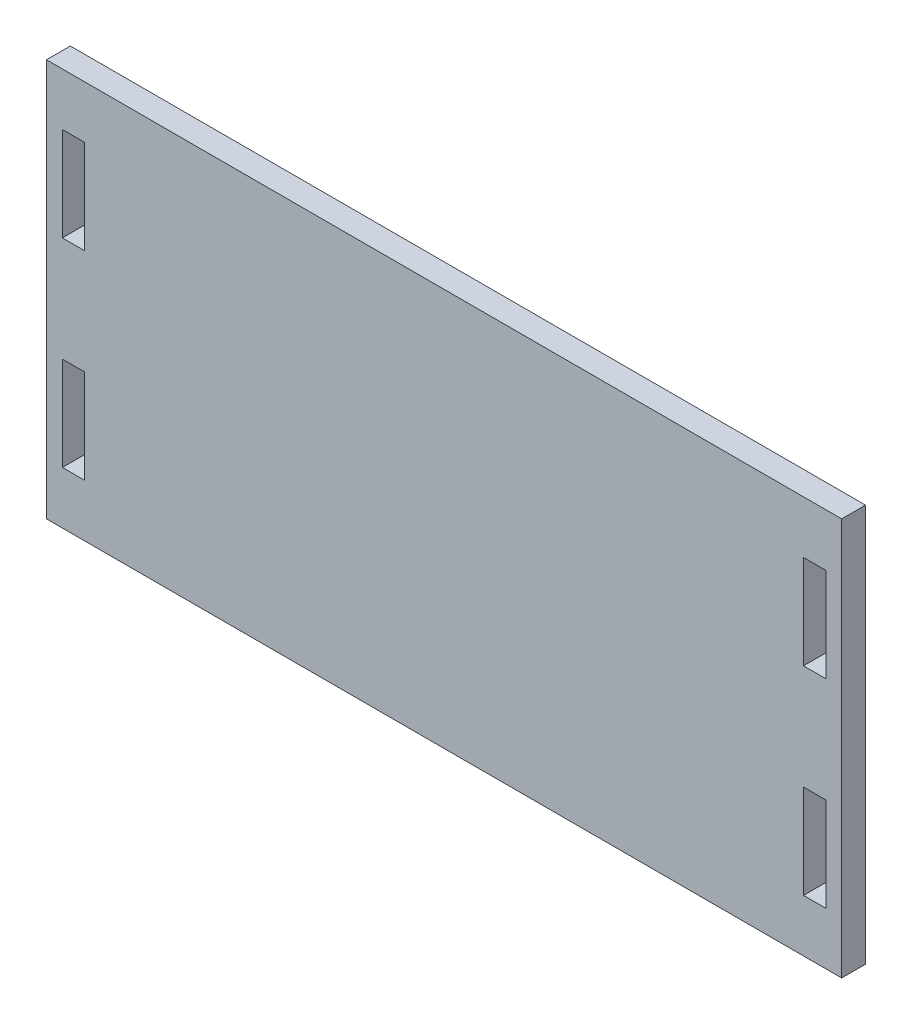
ISO-10303-21;
HEADER;
FILE_DESCRIPTION(('STEP AP214'),'2;1');
FILE_NAME('part.step','',(''),(''),'','','');
FILE_SCHEMA(('AUTOMOTIVE_DESIGN { 1 0 10303 214 1 1 1 1 }'));
ENDSEC;
DATA;
#1=APPLICATION_CONTEXT('core data for automotive mechanical design processes');
#2=APPLICATION_PROTOCOL_DEFINITION('international standard','automotive_design',2000,#1);
#3=PRODUCT_CONTEXT('',#1,'mechanical');
#4=PRODUCT('Part','Part','',(#3));
#5=PRODUCT_RELATED_PRODUCT_CATEGORY('part','',(#4));
#6=PRODUCT_DEFINITION_FORMATION('','',#4);
#7=PRODUCT_DEFINITION_CONTEXT('part definition',#1,'design');
#8=PRODUCT_DEFINITION('design','',#6,#7);
#9=PRODUCT_DEFINITION_SHAPE('','',#8);
#10=(LENGTH_UNIT() NAMED_UNIT(*) SI_UNIT(.MILLI.,.METRE.));
#11=(NAMED_UNIT(*) PLANE_ANGLE_UNIT() SI_UNIT($,.RADIAN.));
#12=(NAMED_UNIT(*) SI_UNIT($,.STERADIAN.) SOLID_ANGLE_UNIT());
#13=UNCERTAINTY_MEASURE_WITH_UNIT(LENGTH_MEASURE(1.E-05),#10,'distance_accuracy_value','');
#14=(GEOMETRIC_REPRESENTATION_CONTEXT(3) GLOBAL_UNCERTAINTY_ASSIGNED_CONTEXT((#13)) GLOBAL_UNIT_ASSIGNED_CONTEXT((#10,
#11,#12)) REPRESENTATION_CONTEXT('',''));
#15=CARTESIAN_POINT('',(0.,0.,0.));
#16=DIRECTION('',(0.,0.,1.));
#17=DIRECTION('',(1.,0.,0.));
#18=AXIS2_PLACEMENT_3D('',#15,#16,#17);
#19=CARTESIAN_POINT('',(0.,0.,-3.));
#20=DIRECTION('',(-1.,0.,0.));
#21=DIRECTION('',(0.,0.,1.));
#22=AXIS2_PLACEMENT_3D('',#19,#20,#21);
#23=PLANE('',#22);
#24=DIRECTION('',(0.,-1.,0.));
#25=VECTOR('',#24,1.);
#26=CARTESIAN_POINT('',(0.,0.,0.));
#27=LINE('',#26,#25);
#28=CARTESIAN_POINT('',(0.,50.,0.));
#29=VERTEX_POINT('',#28);
#30=CARTESIAN_POINT('',(0.,0.,0.));
#31=VERTEX_POINT('',#30);
#32=EDGE_CURVE('E298',#29,#31,#27,.T.);
#33=ORIENTED_EDGE('',*,*,#32,.F.);
#34=DIRECTION('',(0.,0.,1.));
#35=VECTOR('',#34,1.);
#36=CARTESIAN_POINT('',(0.,50.,-3.));
#37=LINE('',#36,#35);
#38=CARTESIAN_POINT('',(0.,50.,-3.));
#39=VERTEX_POINT('',#38);
#40=EDGE_CURVE('E11',#39,#29,#37,.T.);
#41=ORIENTED_EDGE('',*,*,#40,.F.);
#42=DIRECTION('',(0.,-1.,0.));
#43=VECTOR('',#42,1.);
#44=CARTESIAN_POINT('',(0.,0.,-3.));
#45=LINE('',#44,#43);
#46=CARTESIAN_POINT('',(0.,0.,-3.));
#47=VERTEX_POINT('',#46);
#48=EDGE_CURVE('E305',#39,#47,#45,.T.);
#49=ORIENTED_EDGE('',*,*,#48,.T.);
#50=DIRECTION('',(0.,0.,1.));
#51=VECTOR('',#50,1.);
#52=CARTESIAN_POINT('',(0.,0.,-3.));
#53=LINE('',#52,#51);
#54=EDGE_CURVE('E38',#47,#31,#53,.T.);
#55=ORIENTED_EDGE('',*,*,#54,.T.);
#56=EDGE_LOOP('',(#33,#41,#49,#55));
#57=FACE_BOUND('',#56,.T.);
#58=ADVANCED_FACE('F35',(#57),#23,.T.);
#59=CARTESIAN_POINT('',(0.,50.,-3.));
#60=DIRECTION('',(0.,1.,0.));
#61=DIRECTION('',(0.,0.,1.));
#62=AXIS2_PLACEMENT_3D('',#59,#60,#61);
#63=PLANE('',#62);
#64=DIRECTION('',(-1.,0.,0.));
#65=VECTOR('',#64,1.);
#66=CARTESIAN_POINT('',(0.,50.,0.));
#67=LINE('',#66,#65);
#68=CARTESIAN_POINT('',(100.,50.,0.));
#69=VERTEX_POINT('',#68);
#70=EDGE_CURVE('E309',#69,#29,#67,.T.);
#71=ORIENTED_EDGE('',*,*,#70,.F.);
#72=DIRECTION('',(0.,0.,1.));
#73=VECTOR('',#72,1.);
#74=CARTESIAN_POINT('',(100.,50.,-3.));
#75=LINE('',#74,#73);
#76=CARTESIAN_POINT('',(100.,50.,-3.));
#77=VERTEX_POINT('',#76);
#78=EDGE_CURVE('E43',#77,#69,#75,.T.);
#79=ORIENTED_EDGE('',*,*,#78,.F.);
#80=DIRECTION('',(-1.,0.,0.));
#81=VECTOR('',#80,1.);
#82=CARTESIAN_POINT('',(0.,50.,-3.));
#83=LINE('',#82,#81);
#84=EDGE_CURVE('E315',#77,#39,#83,.T.);
#85=ORIENTED_EDGE('',*,*,#84,.T.);
#86=ORIENTED_EDGE('',*,*,#40,.T.);
#87=EDGE_LOOP('',(#71,#79,#85,#86));
#88=FACE_BOUND('',#87,.T.);
#89=ADVANCED_FACE('F341',(#88),#63,.T.);
#90=CARTESIAN_POINT('',(100.,0.,-3.));
#91=DIRECTION('',(1.,0.,0.));
#92=DIRECTION('',(0.,0.,-1.));
#93=AXIS2_PLACEMENT_3D('',#90,#91,#92);
#94=PLANE('',#93);
#95=DIRECTION('',(0.,1.,0.));
#96=VECTOR('',#95,1.);
#97=CARTESIAN_POINT('',(100.,0.,0.));
#98=LINE('',#97,#96);
#99=CARTESIAN_POINT('',(100.,0.,0.));
#100=VERTEX_POINT('',#99);
#101=EDGE_CURVE('E323',#100,#69,#98,.T.);
#102=ORIENTED_EDGE('',*,*,#101,.F.);
#103=DIRECTION('',(0.,0.,1.));
#104=VECTOR('',#103,1.);
#105=CARTESIAN_POINT('',(100.,0.,-3.));
#106=LINE('',#105,#104);
#107=CARTESIAN_POINT('',(100.,0.,-3.));
#108=VERTEX_POINT('',#107);
#109=EDGE_CURVE('E328',#108,#100,#106,.T.);
#110=ORIENTED_EDGE('',*,*,#109,.F.);
#111=DIRECTION('',(0.,1.,0.));
#112=VECTOR('',#111,1.);
#113=CARTESIAN_POINT('',(100.,0.,-3.));
#114=LINE('',#113,#112);
#115=EDGE_CURVE('E312',#108,#77,#114,.T.);
#116=ORIENTED_EDGE('',*,*,#115,.T.);
#117=ORIENTED_EDGE('',*,*,#78,.T.);
#118=EDGE_LOOP('',(#102,#110,#116,#117));
#119=FACE_BOUND('',#118,.T.);
#120=ADVANCED_FACE('F346',(#119),#94,.T.);
#121=CARTESIAN_POINT('',(0.,0.,-3.));
#122=DIRECTION('',(0.,-1.,0.));
#123=DIRECTION('',(0.,0.,-1.));
#124=AXIS2_PLACEMENT_3D('',#121,#122,#123);
#125=PLANE('',#124);
#126=DIRECTION('',(1.,0.,0.));
#127=VECTOR('',#126,1.);
#128=CARTESIAN_POINT('',(0.,0.,0.));
#129=LINE('',#128,#127);
#130=EDGE_CURVE('E320',#31,#100,#129,.T.);
#131=ORIENTED_EDGE('',*,*,#130,.F.);
#132=ORIENTED_EDGE('',*,*,#54,.F.);
#133=DIRECTION('',(1.,0.,0.));
#134=VECTOR('',#133,1.);
#135=CARTESIAN_POINT('',(0.,0.,-3.));
#136=LINE('',#135,#134);
#137=EDGE_CURVE('E308',#47,#108,#136,.T.);
#138=ORIENTED_EDGE('',*,*,#137,.T.);
#139=ORIENTED_EDGE('',*,*,#109,.T.);
#140=EDGE_LOOP('',(#131,#132,#138,#139));
#141=FACE_BOUND('',#140,.T.);
#142=ADVANCED_FACE('F336',(#141),#125,.T.);
#143=CARTESIAN_POINT('',(0.,0.,-3.));
#144=DIRECTION('',(0.,0.,-1.));
#145=DIRECTION('',(-1.,0.,0.));
#146=AXIS2_PLACEMENT_3D('',#143,#144,#145);
#147=PLANE('',#146);
#148=DIRECTION('',(0.,1.,0.));
#149=VECTOR('',#148,1.);
#150=CARTESIAN_POINT('',(98.,43.4,-3.));
#151=LINE('',#150,#149);
#152=CARTESIAN_POINT('',(98.,31.6,-3.));
#153=VERTEX_POINT('',#152);
#154=CARTESIAN_POINT('',(98.,43.4,-3.));
#155=VERTEX_POINT('',#154);
#156=EDGE_CURVE('E174',#153,#155,#151,.T.);
#157=ORIENTED_EDGE('',*,*,#156,.T.);
#158=DIRECTION('',(-1.,0.,0.));
#159=VECTOR('',#158,1.);
#160=CARTESIAN_POINT('',(98.,43.4,-3.));
#161=LINE('',#160,#159);
#162=CARTESIAN_POINT('',(95.2,43.4,-3.));
#163=VERTEX_POINT('',#162);
#164=EDGE_CURVE('E183',#155,#163,#161,.T.);
#165=ORIENTED_EDGE('',*,*,#164,.T.);
#166=DIRECTION('',(0.,-1.,0.));
#167=VECTOR('',#166,1.);
#168=CARTESIAN_POINT('',(95.2,43.4,-3.));
#169=LINE('',#168,#167);
#170=CARTESIAN_POINT('',(95.2,31.6,-3.));
#171=VERTEX_POINT('',#170);
#172=EDGE_CURVE('E51',#163,#171,#169,.T.);
#173=ORIENTED_EDGE('',*,*,#172,.T.);
#174=DIRECTION('',(1.,0.,0.));
#175=VECTOR('',#174,1.);
#176=CARTESIAN_POINT('',(98.,31.6,-3.));
#177=LINE('',#176,#175);
#178=EDGE_CURVE('E180',#171,#153,#177,.T.);
#179=ORIENTED_EDGE('',*,*,#178,.T.);
#180=EDGE_LOOP('',(#157,#165,#173,#179));
#181=FACE_BOUND('',#180,.T.);
#182=DIRECTION('',(1.,0.,0.));
#183=VECTOR('',#182,1.);
#184=CARTESIAN_POINT('',(98.,6.59999999999999,-3.));
#185=LINE('',#184,#183);
#186=CARTESIAN_POINT('',(95.2,6.59999999999999,-3.));
#187=VERTEX_POINT('',#186);
#188=CARTESIAN_POINT('',(98.,6.59999999999999,-3.));
#189=VERTEX_POINT('',#188);
#190=EDGE_CURVE('E209',#187,#189,#185,.T.);
#191=ORIENTED_EDGE('',*,*,#190,.T.);
#192=DIRECTION('',(0.,1.,0.));
#193=VECTOR('',#192,1.);
#194=CARTESIAN_POINT('',(98.,6.59999999999999,-3.));
#195=LINE('',#194,#193);
#196=CARTESIAN_POINT('',(98.,18.4,-3.));
#197=VERTEX_POINT('',#196);
#198=EDGE_CURVE('E212',#189,#197,#195,.T.);
#199=ORIENTED_EDGE('',*,*,#198,.T.);
#200=DIRECTION('',(-1.,0.,0.));
#201=VECTOR('',#200,1.);
#202=CARTESIAN_POINT('',(98.,18.4,-3.));
#203=LINE('',#202,#201);
#204=CARTESIAN_POINT('',(95.2,18.4,-3.));
#205=VERTEX_POINT('',#204);
#206=EDGE_CURVE('E216',#197,#205,#203,.T.);
#207=ORIENTED_EDGE('',*,*,#206,.T.);
#208=DIRECTION('',(0.,-1.,0.));
#209=VECTOR('',#208,1.);
#210=CARTESIAN_POINT('',(95.2,6.59999999999999,-3.));
#211=LINE('',#210,#209);
#212=EDGE_CURVE('E219',#205,#187,#211,.T.);
#213=ORIENTED_EDGE('',*,*,#212,.T.);
#214=EDGE_LOOP('',(#191,#199,#207,#213));
#215=FACE_BOUND('',#214,.T.);
#216=DIRECTION('',(0.,-1.,0.));
#217=VECTOR('',#216,1.);
#218=CARTESIAN_POINT('',(2.,6.59999999999999,-3.));
#219=LINE('',#218,#217);
#220=CARTESIAN_POINT('',(2.,18.4,-3.));
#221=VERTEX_POINT('',#220);
#222=CARTESIAN_POINT('',(2.,6.59999999999999,-3.));
#223=VERTEX_POINT('',#222);
#224=EDGE_CURVE('E241',#221,#223,#219,.T.);
#225=ORIENTED_EDGE('',*,*,#224,.T.);
#226=DIRECTION('',(1.,0.,0.));
#227=VECTOR('',#226,1.);
#228=CARTESIAN_POINT('',(2.,6.59999999999999,-3.));
#229=LINE('',#228,#227);
#230=CARTESIAN_POINT('',(4.8,6.59999999999999,-3.));
#231=VERTEX_POINT('',#230);
#232=EDGE_CURVE('E244',#223,#231,#229,.T.);
#233=ORIENTED_EDGE('',*,*,#232,.T.);
#234=DIRECTION('',(0.,1.,0.));
#235=VECTOR('',#234,1.);
#236=CARTESIAN_POINT('',(4.8,6.59999999999999,-3.));
#237=LINE('',#236,#235);
#238=CARTESIAN_POINT('',(4.8,18.4,-3.));
#239=VERTEX_POINT('',#238);
#240=EDGE_CURVE('E248',#231,#239,#237,.T.);
#241=ORIENTED_EDGE('',*,*,#240,.T.);
#242=DIRECTION('',(-1.,0.,0.));
#243=VECTOR('',#242,1.);
#244=CARTESIAN_POINT('',(2.,18.4,-3.));
#245=LINE('',#244,#243);
#246=EDGE_CURVE('E251',#239,#221,#245,.T.);
#247=ORIENTED_EDGE('',*,*,#246,.T.);
#248=EDGE_LOOP('',(#225,#233,#241,#247));
#249=FACE_BOUND('',#248,.T.);
#250=DIRECTION('',(0.,-1.,0.));
#251=VECTOR('',#250,1.);
#252=CARTESIAN_POINT('',(2.,43.4,-3.));
#253=LINE('',#252,#251);
#254=CARTESIAN_POINT('',(2.,43.4,-3.));
#255=VERTEX_POINT('',#254);
#256=CARTESIAN_POINT('',(2.,31.6,-3.));
#257=VERTEX_POINT('',#256);
#258=EDGE_CURVE('E273',#255,#257,#253,.T.);
#259=ORIENTED_EDGE('',*,*,#258,.T.);
#260=DIRECTION('',(1.,0.,0.));
#261=VECTOR('',#260,1.);
#262=CARTESIAN_POINT('',(2.,31.6,-3.));
#263=LINE('',#262,#261);
#264=CARTESIAN_POINT('',(4.8,31.6,-3.));
#265=VERTEX_POINT('',#264);
#266=EDGE_CURVE('E276',#257,#265,#263,.T.);
#267=ORIENTED_EDGE('',*,*,#266,.T.);
#268=DIRECTION('',(0.,1.,0.));
#269=VECTOR('',#268,1.);
#270=CARTESIAN_POINT('',(4.8,43.4,-3.));
#271=LINE('',#270,#269);
#272=CARTESIAN_POINT('',(4.8,43.4,-3.));
#273=VERTEX_POINT('',#272);
#274=EDGE_CURVE('E280',#265,#273,#271,.T.);
#275=ORIENTED_EDGE('',*,*,#274,.T.);
#276=DIRECTION('',(-1.,0.,0.));
#277=VECTOR('',#276,1.);
#278=CARTESIAN_POINT('',(2.,43.4,-3.));
#279=LINE('',#278,#277);
#280=EDGE_CURVE('E283',#273,#255,#279,.T.);
#281=ORIENTED_EDGE('',*,*,#280,.T.);
#282=EDGE_LOOP('',(#259,#267,#275,#281));
#283=FACE_BOUND('',#282,.T.);
#284=ORIENTED_EDGE('',*,*,#48,.F.);
#285=ORIENTED_EDGE('',*,*,#84,.F.);
#286=ORIENTED_EDGE('',*,*,#115,.F.);
#287=ORIENTED_EDGE('',*,*,#137,.F.);
#288=EDGE_LOOP('',(#284,#285,#286,#287));
#289=FACE_BOUND('',#288,.T.);
#290=ADVANCED_FACE('F187',(#181,#215,#249,#283,#289),#147,.T.);
#291=CARTESIAN_POINT('',(0.,0.,0.));
#292=DIRECTION('',(0.,0.,-1.));
#293=DIRECTION('',(-1.,0.,0.));
#294=AXIS2_PLACEMENT_3D('',#291,#292,#293);
#295=PLANE('',#294);
#296=DIRECTION('',(-1.,0.,0.));
#297=VECTOR('',#296,1.);
#298=CARTESIAN_POINT('',(98.,43.4,0.));
#299=LINE('',#298,#297);
#300=CARTESIAN_POINT('',(98.,43.4,0.));
#301=VERTEX_POINT('',#300);
#302=CARTESIAN_POINT('',(95.2,43.4,0.));
#303=VERTEX_POINT('',#302);
#304=EDGE_CURVE('E199',#301,#303,#299,.T.);
#305=ORIENTED_EDGE('',*,*,#304,.F.);
#306=DIRECTION('',(0.,1.,0.));
#307=VECTOR('',#306,1.);
#308=CARTESIAN_POINT('',(98.,43.4,0.));
#309=LINE('',#308,#307);
#310=CARTESIAN_POINT('',(98.,31.6,0.));
#311=VERTEX_POINT('',#310);
#312=EDGE_CURVE('E59',#311,#301,#309,.T.);
#313=ORIENTED_EDGE('',*,*,#312,.F.);
#314=DIRECTION('',(1.,0.,0.));
#315=VECTOR('',#314,1.);
#316=CARTESIAN_POINT('',(98.,31.6,0.));
#317=LINE('',#316,#315);
#318=CARTESIAN_POINT('',(95.2,31.6,0.));
#319=VERTEX_POINT('',#318);
#320=EDGE_CURVE('E190',#319,#311,#317,.T.);
#321=ORIENTED_EDGE('',*,*,#320,.F.);
#322=DIRECTION('',(0.,-1.,0.));
#323=VECTOR('',#322,1.);
#324=CARTESIAN_POINT('',(95.2,43.4,0.));
#325=LINE('',#324,#323);
#326=EDGE_CURVE('E193',#303,#319,#325,.T.);
#327=ORIENTED_EDGE('',*,*,#326,.F.);
#328=EDGE_LOOP('',(#305,#313,#321,#327));
#329=FACE_BOUND('',#328,.T.);
#330=DIRECTION('',(0.,1.,0.));
#331=VECTOR('',#330,1.);
#332=CARTESIAN_POINT('',(98.,6.59999999999999,0.));
#333=LINE('',#332,#331);
#334=CARTESIAN_POINT('',(98.,6.59999999999999,0.));
#335=VERTEX_POINT('',#334);
#336=CARTESIAN_POINT('',(98.,18.4,0.));
#337=VERTEX_POINT('',#336);
#338=EDGE_CURVE('E224',#335,#337,#333,.T.);
#339=ORIENTED_EDGE('',*,*,#338,.F.);
#340=DIRECTION('',(1.,0.,0.));
#341=VECTOR('',#340,1.);
#342=CARTESIAN_POINT('',(98.,6.59999999999999,0.));
#343=LINE('',#342,#341);
#344=CARTESIAN_POINT('',(95.2,6.59999999999999,0.));
#345=VERTEX_POINT('',#344);
#346=EDGE_CURVE('E205',#345,#335,#343,.T.);
#347=ORIENTED_EDGE('',*,*,#346,.F.);
#348=DIRECTION('',(0.,-1.,0.));
#349=VECTOR('',#348,1.);
#350=CARTESIAN_POINT('',(95.2,6.59999999999999,0.));
#351=LINE('',#350,#349);
#352=CARTESIAN_POINT('',(95.2,18.4,0.));
#353=VERTEX_POINT('',#352);
#354=EDGE_CURVE('E213',#353,#345,#351,.T.);
#355=ORIENTED_EDGE('',*,*,#354,.F.);
#356=DIRECTION('',(-1.,0.,0.));
#357=VECTOR('',#356,1.);
#358=CARTESIAN_POINT('',(98.,18.4,0.));
#359=LINE('',#358,#357);
#360=EDGE_CURVE('E227',#337,#353,#359,.T.);
#361=ORIENTED_EDGE('',*,*,#360,.F.);
#362=EDGE_LOOP('',(#339,#347,#355,#361));
#363=FACE_BOUND('',#362,.T.);
#364=DIRECTION('',(1.,0.,0.));
#365=VECTOR('',#364,1.);
#366=CARTESIAN_POINT('',(2.,6.59999999999999,0.));
#367=LINE('',#366,#365);
#368=CARTESIAN_POINT('',(2.,6.59999999999999,0.));
#369=VERTEX_POINT('',#368);
#370=CARTESIAN_POINT('',(4.8,6.59999999999999,0.));
#371=VERTEX_POINT('',#370);
#372=EDGE_CURVE('E256',#369,#371,#367,.T.);
#373=ORIENTED_EDGE('',*,*,#372,.F.);
#374=DIRECTION('',(0.,-1.,0.));
#375=VECTOR('',#374,1.);
#376=CARTESIAN_POINT('',(2.,6.59999999999999,0.));
#377=LINE('',#376,#375);
#378=CARTESIAN_POINT('',(2.,18.4,0.));
#379=VERTEX_POINT('',#378);
#380=EDGE_CURVE('E234',#379,#369,#377,.T.);
#381=ORIENTED_EDGE('',*,*,#380,.F.);
#382=DIRECTION('',(-1.,0.,0.));
#383=VECTOR('',#382,1.);
#384=CARTESIAN_POINT('',(2.,18.4,0.));
#385=LINE('',#384,#383);
#386=CARTESIAN_POINT('',(4.8,18.4,0.));
#387=VERTEX_POINT('',#386);
#388=EDGE_CURVE('E245',#387,#379,#385,.T.);
#389=ORIENTED_EDGE('',*,*,#388,.F.);
#390=DIRECTION('',(0.,1.,0.));
#391=VECTOR('',#390,1.);
#392=CARTESIAN_POINT('',(4.8,6.59999999999999,0.));
#393=LINE('',#392,#391);
#394=EDGE_CURVE('E259',#371,#387,#393,.T.);
#395=ORIENTED_EDGE('',*,*,#394,.F.);
#396=EDGE_LOOP('',(#373,#381,#389,#395));
#397=FACE_BOUND('',#396,.T.);
#398=DIRECTION('',(1.,0.,0.));
#399=VECTOR('',#398,1.);
#400=CARTESIAN_POINT('',(2.,31.6,0.));
#401=LINE('',#400,#399);
#402=CARTESIAN_POINT('',(2.,31.6,0.));
#403=VERTEX_POINT('',#402);
#404=CARTESIAN_POINT('',(4.8,31.6,0.));
#405=VERTEX_POINT('',#404);
#406=EDGE_CURVE('E288',#403,#405,#401,.T.);
#407=ORIENTED_EDGE('',*,*,#406,.F.);
#408=DIRECTION('',(0.,-1.,0.));
#409=VECTOR('',#408,1.);
#410=CARTESIAN_POINT('',(2.,43.4,0.));
#411=LINE('',#410,#409);
#412=CARTESIAN_POINT('',(2.,43.4,0.));
#413=VERTEX_POINT('',#412);
#414=EDGE_CURVE('E266',#413,#403,#411,.T.);
#415=ORIENTED_EDGE('',*,*,#414,.F.);
#416=DIRECTION('',(-1.,0.,0.));
#417=VECTOR('',#416,1.);
#418=CARTESIAN_POINT('',(2.,43.4,0.));
#419=LINE('',#418,#417);
#420=CARTESIAN_POINT('',(4.8,43.4,0.));
#421=VERTEX_POINT('',#420);
#422=EDGE_CURVE('E277',#421,#413,#419,.T.);
#423=ORIENTED_EDGE('',*,*,#422,.F.);
#424=DIRECTION('',(0.,1.,0.));
#425=VECTOR('',#424,1.);
#426=CARTESIAN_POINT('',(4.8,43.4,0.));
#427=LINE('',#426,#425);
#428=EDGE_CURVE('E291',#405,#421,#427,.T.);
#429=ORIENTED_EDGE('',*,*,#428,.F.);
#430=EDGE_LOOP('',(#407,#415,#423,#429));
#431=FACE_BOUND('',#430,.T.);
#432=ORIENTED_EDGE('',*,*,#32,.T.);
#433=ORIENTED_EDGE('',*,*,#130,.T.);
#434=ORIENTED_EDGE('',*,*,#101,.T.);
#435=ORIENTED_EDGE('',*,*,#70,.T.);
#436=EDGE_LOOP('',(#432,#433,#434,#435));
#437=FACE_BOUND('',#436,.T.);
#438=ADVANCED_FACE('F338',(#329,#363,#397,#431,#437),#295,.F.);
#439=CARTESIAN_POINT('',(2.,43.4,-3.));
#440=DIRECTION('',(-1.,0.,0.));
#441=DIRECTION('',(0.,0.,1.));
#442=AXIS2_PLACEMENT_3D('',#439,#440,#441);
#443=PLANE('',#442);
#444=ORIENTED_EDGE('',*,*,#414,.T.);
#445=DIRECTION('',(0.,0.,1.));
#446=VECTOR('',#445,1.);
#447=CARTESIAN_POINT('',(2.,31.6,-3.));
#448=LINE('',#447,#446);
#449=EDGE_CURVE('E286',#257,#403,#448,.T.);
#450=ORIENTED_EDGE('',*,*,#449,.F.);
#451=ORIENTED_EDGE('',*,*,#258,.F.);
#452=DIRECTION('',(0.,0.,1.));
#453=VECTOR('',#452,1.);
#454=CARTESIAN_POINT('',(2.,43.4,-3.));
#455=LINE('',#454,#453);
#456=EDGE_CURVE('E296',#255,#413,#455,.T.);
#457=ORIENTED_EDGE('',*,*,#456,.T.);
#458=EDGE_LOOP('',(#444,#450,#451,#457));
#459=FACE_BOUND('',#458,.T.);
#460=ADVANCED_FACE('F388',(#459),#443,.F.);
#461=CARTESIAN_POINT('',(2.,43.4,-3.));
#462=DIRECTION('',(0.,1.,0.));
#463=DIRECTION('',(0.,0.,1.));
#464=AXIS2_PLACEMENT_3D('',#461,#462,#463);
#465=PLANE('',#464);
#466=ORIENTED_EDGE('',*,*,#422,.T.);
#467=ORIENTED_EDGE('',*,*,#456,.F.);
#468=ORIENTED_EDGE('',*,*,#280,.F.);
#469=DIRECTION('',(0.,0.,1.));
#470=VECTOR('',#469,1.);
#471=CARTESIAN_POINT('',(4.8,43.4,-3.));
#472=LINE('',#471,#470);
#473=EDGE_CURVE('E299',#273,#421,#472,.T.);
#474=ORIENTED_EDGE('',*,*,#473,.T.);
#475=EDGE_LOOP('',(#466,#467,#468,#474));
#476=FACE_BOUND('',#475,.T.);
#477=ADVANCED_FACE('F398',(#476),#465,.F.);
#478=CARTESIAN_POINT('',(4.8,43.4,-3.));
#479=DIRECTION('',(1.,0.,0.));
#480=DIRECTION('',(0.,0.,-1.));
#481=AXIS2_PLACEMENT_3D('',#478,#479,#480);
#482=PLANE('',#481);
#483=ORIENTED_EDGE('',*,*,#428,.T.);
#484=ORIENTED_EDGE('',*,*,#473,.F.);
#485=ORIENTED_EDGE('',*,*,#274,.F.);
#486=DIRECTION('',(0.,0.,1.));
#487=VECTOR('',#486,1.);
#488=CARTESIAN_POINT('',(4.8,31.6,-3.));
#489=LINE('',#488,#487);
#490=EDGE_CURVE('E301',#265,#405,#489,.T.);
#491=ORIENTED_EDGE('',*,*,#490,.T.);
#492=EDGE_LOOP('',(#483,#484,#485,#491));
#493=FACE_BOUND('',#492,.T.);
#494=ADVANCED_FACE('F408',(#493),#482,.F.);
#495=CARTESIAN_POINT('',(2.,31.6,-3.));
#496=DIRECTION('',(0.,-1.,0.));
#497=DIRECTION('',(0.,0.,-1.));
#498=AXIS2_PLACEMENT_3D('',#495,#496,#497);
#499=PLANE('',#498);
#500=ORIENTED_EDGE('',*,*,#406,.T.);
#501=ORIENTED_EDGE('',*,*,#490,.F.);
#502=ORIENTED_EDGE('',*,*,#266,.F.);
#503=ORIENTED_EDGE('',*,*,#449,.T.);
#504=EDGE_LOOP('',(#500,#501,#502,#503));
#505=FACE_BOUND('',#504,.T.);
#506=ADVANCED_FACE('F418',(#505),#499,.F.);
#507=CARTESIAN_POINT('',(2.,6.59999999999999,-3.));
#508=DIRECTION('',(-1.,0.,0.));
#509=DIRECTION('',(0.,0.,1.));
#510=AXIS2_PLACEMENT_3D('',#507,#508,#509);
#511=PLANE('',#510);
#512=ORIENTED_EDGE('',*,*,#380,.T.);
#513=DIRECTION('',(0.,0.,1.));
#514=VECTOR('',#513,1.);
#515=CARTESIAN_POINT('',(2.,6.59999999999999,-3.));
#516=LINE('',#515,#514);
#517=EDGE_CURVE('E254',#223,#369,#516,.T.);
#518=ORIENTED_EDGE('',*,*,#517,.F.);
#519=ORIENTED_EDGE('',*,*,#224,.F.);
#520=DIRECTION('',(0.,0.,1.));
#521=VECTOR('',#520,1.);
#522=CARTESIAN_POINT('',(2.,18.4,-3.));
#523=LINE('',#522,#521);
#524=EDGE_CURVE('E264',#221,#379,#523,.T.);
#525=ORIENTED_EDGE('',*,*,#524,.T.);
#526=EDGE_LOOP('',(#512,#518,#519,#525));
#527=FACE_BOUND('',#526,.T.);
#528=ADVANCED_FACE('F428',(#527),#511,.F.);
#529=CARTESIAN_POINT('',(2.,18.4,-3.));
#530=DIRECTION('',(0.,1.,0.));
#531=DIRECTION('',(0.,0.,1.));
#532=AXIS2_PLACEMENT_3D('',#529,#530,#531);
#533=PLANE('',#532);
#534=ORIENTED_EDGE('',*,*,#388,.T.);
#535=ORIENTED_EDGE('',*,*,#524,.F.);
#536=ORIENTED_EDGE('',*,*,#246,.F.);
#537=DIRECTION('',(0.,0.,1.));
#538=VECTOR('',#537,1.);
#539=CARTESIAN_POINT('',(4.8,18.4,-3.));
#540=LINE('',#539,#538);
#541=EDGE_CURVE('E267',#239,#387,#540,.T.);
#542=ORIENTED_EDGE('',*,*,#541,.T.);
#543=EDGE_LOOP('',(#534,#535,#536,#542));
#544=FACE_BOUND('',#543,.T.);
#545=ADVANCED_FACE('F438',(#544),#533,.F.);
#546=CARTESIAN_POINT('',(4.8,6.59999999999999,-3.));
#547=DIRECTION('',(1.,0.,0.));
#548=DIRECTION('',(0.,0.,-1.));
#549=AXIS2_PLACEMENT_3D('',#546,#547,#548);
#550=PLANE('',#549);
#551=ORIENTED_EDGE('',*,*,#394,.T.);
#552=ORIENTED_EDGE('',*,*,#541,.F.);
#553=ORIENTED_EDGE('',*,*,#240,.F.);
#554=DIRECTION('',(0.,0.,1.));
#555=VECTOR('',#554,1.);
#556=CARTESIAN_POINT('',(4.8,6.59999999999999,-3.));
#557=LINE('',#556,#555);
#558=EDGE_CURVE('E269',#231,#371,#557,.T.);
#559=ORIENTED_EDGE('',*,*,#558,.T.);
#560=EDGE_LOOP('',(#551,#552,#553,#559));
#561=FACE_BOUND('',#560,.T.);
#562=ADVANCED_FACE('F448',(#561),#550,.F.);
#563=CARTESIAN_POINT('',(2.,6.59999999999999,-3.));
#564=DIRECTION('',(0.,-1.,0.));
#565=DIRECTION('',(0.,0.,-1.));
#566=AXIS2_PLACEMENT_3D('',#563,#564,#565);
#567=PLANE('',#566);
#568=ORIENTED_EDGE('',*,*,#372,.T.);
#569=ORIENTED_EDGE('',*,*,#558,.F.);
#570=ORIENTED_EDGE('',*,*,#232,.F.);
#571=ORIENTED_EDGE('',*,*,#517,.T.);
#572=EDGE_LOOP('',(#568,#569,#570,#571));
#573=FACE_BOUND('',#572,.T.);
#574=ADVANCED_FACE('F458',(#573),#567,.F.);
#575=CARTESIAN_POINT('',(98.,6.59999999999999,-3.));
#576=DIRECTION('',(0.,-1.,0.));
#577=DIRECTION('',(0.,0.,-1.));
#578=AXIS2_PLACEMENT_3D('',#575,#576,#577);
#579=PLANE('',#578);
#580=ORIENTED_EDGE('',*,*,#346,.T.);
#581=DIRECTION('',(0.,0.,1.));
#582=VECTOR('',#581,1.);
#583=CARTESIAN_POINT('',(98.,6.59999999999999,-3.));
#584=LINE('',#583,#582);
#585=EDGE_CURVE('E222',#189,#335,#584,.T.);
#586=ORIENTED_EDGE('',*,*,#585,.F.);
#587=ORIENTED_EDGE('',*,*,#190,.F.);
#588=DIRECTION('',(0.,0.,1.));
#589=VECTOR('',#588,1.);
#590=CARTESIAN_POINT('',(95.2,6.59999999999999,-3.));
#591=LINE('',#590,#589);
#592=EDGE_CURVE('E232',#187,#345,#591,.T.);
#593=ORIENTED_EDGE('',*,*,#592,.T.);
#594=EDGE_LOOP('',(#580,#586,#587,#593));
#595=FACE_BOUND('',#594,.T.);
#596=ADVANCED_FACE('F468',(#595),#579,.F.);
#597=CARTESIAN_POINT('',(95.2,6.59999999999999,-3.));
#598=DIRECTION('',(-1.,0.,0.));
#599=DIRECTION('',(0.,0.,1.));
#600=AXIS2_PLACEMENT_3D('',#597,#598,#599);
#601=PLANE('',#600);
#602=ORIENTED_EDGE('',*,*,#354,.T.);
#603=ORIENTED_EDGE('',*,*,#592,.F.);
#604=ORIENTED_EDGE('',*,*,#212,.F.);
#605=DIRECTION('',(0.,0.,1.));
#606=VECTOR('',#605,1.);
#607=CARTESIAN_POINT('',(95.2,18.4,-3.));
#608=LINE('',#607,#606);
#609=EDGE_CURVE('E235',#205,#353,#608,.T.);
#610=ORIENTED_EDGE('',*,*,#609,.T.);
#611=EDGE_LOOP('',(#602,#603,#604,#610));
#612=FACE_BOUND('',#611,.T.);
#613=ADVANCED_FACE('F478',(#612),#601,.F.);
#614=CARTESIAN_POINT('',(98.,18.4,-3.));
#615=DIRECTION('',(0.,1.,0.));
#616=DIRECTION('',(0.,0.,1.));
#617=AXIS2_PLACEMENT_3D('',#614,#615,#616);
#618=PLANE('',#617);
#619=ORIENTED_EDGE('',*,*,#360,.T.);
#620=ORIENTED_EDGE('',*,*,#609,.F.);
#621=ORIENTED_EDGE('',*,*,#206,.F.);
#622=DIRECTION('',(0.,0.,1.));
#623=VECTOR('',#622,1.);
#624=CARTESIAN_POINT('',(98.,18.4,-3.));
#625=LINE('',#624,#623);
#626=EDGE_CURVE('E237',#197,#337,#625,.T.);
#627=ORIENTED_EDGE('',*,*,#626,.T.);
#628=EDGE_LOOP('',(#619,#620,#621,#627));
#629=FACE_BOUND('',#628,.T.);
#630=ADVANCED_FACE('F488',(#629),#618,.F.);
#631=CARTESIAN_POINT('',(98.,6.59999999999999,-3.));
#632=DIRECTION('',(1.,0.,0.));
#633=DIRECTION('',(0.,0.,-1.));
#634=AXIS2_PLACEMENT_3D('',#631,#632,#633);
#635=PLANE('',#634);
#636=ORIENTED_EDGE('',*,*,#338,.T.);
#637=ORIENTED_EDGE('',*,*,#626,.F.);
#638=ORIENTED_EDGE('',*,*,#198,.F.);
#639=ORIENTED_EDGE('',*,*,#585,.T.);
#640=EDGE_LOOP('',(#636,#637,#638,#639));
#641=FACE_BOUND('',#640,.T.);
#642=ADVANCED_FACE('F498',(#641),#635,.F.);
#643=CARTESIAN_POINT('',(98.,43.4,-3.));
#644=DIRECTION('',(1.,0.,0.));
#645=DIRECTION('',(0.,0.,-1.));
#646=AXIS2_PLACEMENT_3D('',#643,#644,#645);
#647=PLANE('',#646);
#648=ORIENTED_EDGE('',*,*,#312,.T.);
#649=DIRECTION('',(0.,0.,1.));
#650=VECTOR('',#649,1.);
#651=CARTESIAN_POINT('',(98.,43.4,-3.));
#652=LINE('',#651,#650);
#653=EDGE_CURVE('E170',#155,#301,#652,.T.);
#654=ORIENTED_EDGE('',*,*,#653,.F.);
#655=ORIENTED_EDGE('',*,*,#156,.F.);
#656=DIRECTION('',(0.,0.,1.));
#657=VECTOR('',#656,1.);
#658=CARTESIAN_POINT('',(98.,31.6,-3.));
#659=LINE('',#658,#657);
#660=EDGE_CURVE('E203',#153,#311,#659,.T.);
#661=ORIENTED_EDGE('',*,*,#660,.T.);
#662=EDGE_LOOP('',(#648,#654,#655,#661));
#663=FACE_BOUND('',#662,.T.);
#664=ADVANCED_FACE('F172',(#663),#647,.F.);
#665=CARTESIAN_POINT('',(98.,31.6,-3.));
#666=DIRECTION('',(0.,-1.,0.));
#667=DIRECTION('',(0.,0.,-1.));
#668=AXIS2_PLACEMENT_3D('',#665,#666,#667);
#669=PLANE('',#668);
#670=ORIENTED_EDGE('',*,*,#320,.T.);
#671=ORIENTED_EDGE('',*,*,#660,.F.);
#672=ORIENTED_EDGE('',*,*,#178,.F.);
#673=DIRECTION('',(0.,0.,1.));
#674=VECTOR('',#673,1.);
#675=CARTESIAN_POINT('',(95.2,31.6,-3.));
#676=LINE('',#675,#674);
#677=EDGE_CURVE('E206',#171,#319,#676,.T.);
#678=ORIENTED_EDGE('',*,*,#677,.T.);
#679=EDGE_LOOP('',(#670,#671,#672,#678));
#680=FACE_BOUND('',#679,.T.);
#681=ADVANCED_FACE('F517',(#680),#669,.F.);
#682=CARTESIAN_POINT('',(95.2,43.4,-3.));
#683=DIRECTION('',(-1.,0.,0.));
#684=DIRECTION('',(0.,0.,1.));
#685=AXIS2_PLACEMENT_3D('',#682,#683,#684);
#686=PLANE('',#685);
#687=ORIENTED_EDGE('',*,*,#326,.T.);
#688=ORIENTED_EDGE('',*,*,#677,.F.);
#689=ORIENTED_EDGE('',*,*,#172,.F.);
#690=DIRECTION('',(0.,0.,1.));
#691=VECTOR('',#690,1.);
#692=CARTESIAN_POINT('',(95.2,43.4,-3.));
#693=LINE('',#692,#691);
#694=EDGE_CURVE('E179',#163,#303,#693,.T.);
#695=ORIENTED_EDGE('',*,*,#694,.T.);
#696=EDGE_LOOP('',(#687,#688,#689,#695));
#697=FACE_BOUND('',#696,.T.);
#698=ADVANCED_FACE('F526',(#697),#686,.F.);
#699=CARTESIAN_POINT('',(98.,43.4,-3.));
#700=DIRECTION('',(0.,1.,0.));
#701=DIRECTION('',(0.,0.,1.));
#702=AXIS2_PLACEMENT_3D('',#699,#700,#701);
#703=PLANE('',#702);
#704=ORIENTED_EDGE('',*,*,#304,.T.);
#705=ORIENTED_EDGE('',*,*,#694,.F.);
#706=ORIENTED_EDGE('',*,*,#164,.F.);
#707=ORIENTED_EDGE('',*,*,#653,.T.);
#708=EDGE_LOOP('',(#704,#705,#706,#707));
#709=FACE_BOUND('',#708,.T.);
#710=ADVANCED_FACE('F184',(#709),#703,.F.);
#711=CLOSED_SHELL('',(#58,#89,#120,#142,#290,#438,#460,#477,#494,#506,#528,#545,#562,#574,#596,
#613,#630,#642,#664,#681,#698,#710));
#712=MANIFOLD_SOLID_BREP('B2',#711);
#713=ADVANCED_BREP_SHAPE_REPRESENTATION('',(#18,#712),#14);
#714=SHAPE_DEFINITION_REPRESENTATION(#9,#713);
ENDSEC;
END-ISO-10303-21;
